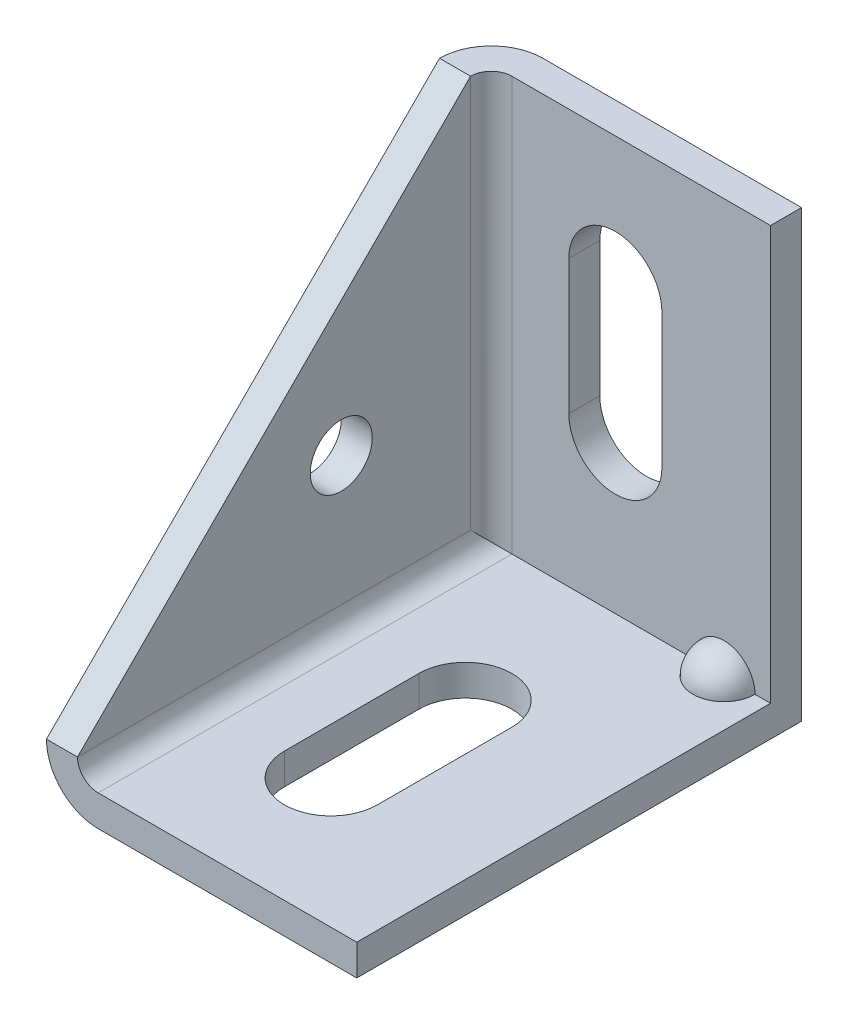
ISO-10303-21;
HEADER;
FILE_DESCRIPTION(('STEP AP214'),'2;1');
FILE_NAME('part.step','',(''),(''),'','','');
FILE_SCHEMA(('AUTOMOTIVE_DESIGN { 1 0 10303 214 1 1 1 1 }'));
ENDSEC;
DATA;
#1=APPLICATION_CONTEXT('core data for automotive mechanical design processes');
#2=APPLICATION_PROTOCOL_DEFINITION('international standard','automotive_design',2000,#1);
#3=PRODUCT_CONTEXT('',#1,'mechanical');
#4=PRODUCT('Part','Part','',(#3));
#5=PRODUCT_RELATED_PRODUCT_CATEGORY('part','',(#4));
#6=PRODUCT_DEFINITION_FORMATION('','',#4);
#7=PRODUCT_DEFINITION_CONTEXT('part definition',#1,'design');
#8=PRODUCT_DEFINITION('design','',#6,#7);
#9=PRODUCT_DEFINITION_SHAPE('','',#8);
#10=(LENGTH_UNIT() NAMED_UNIT(*) SI_UNIT(.MILLI.,.METRE.));
#11=(NAMED_UNIT(*) PLANE_ANGLE_UNIT() SI_UNIT($,.RADIAN.));
#12=(NAMED_UNIT(*) SI_UNIT($,.STERADIAN.) SOLID_ANGLE_UNIT());
#13=UNCERTAINTY_MEASURE_WITH_UNIT(LENGTH_MEASURE(1.E-05),#10,'distance_accuracy_value','');
#14=(GEOMETRIC_REPRESENTATION_CONTEXT(3) GLOBAL_UNCERTAINTY_ASSIGNED_CONTEXT((#13)) GLOBAL_UNIT_ASSIGNED_CONTEXT((#10,
#11,#12)) REPRESENTATION_CONTEXT('',''));
#15=CARTESIAN_POINT('',(0.,0.,0.));
#16=DIRECTION('',(0.,0.,1.));
#17=DIRECTION('',(1.,0.,0.));
#18=AXIS2_PLACEMENT_3D('',#15,#16,#17);
#19=CARTESIAN_POINT('',(10.5,3.,3.));
#20=DIRECTION('',(-1.,0.,0.));
#21=DIRECTION('',(0.,-0.707106781186547,-0.707106781186548));
#22=AXIS2_PLACEMENT_3D('',#19,#20,#21);
#23=SPHERICAL_SURFACE('',#22,3.);
#24=CARTESIAN_POINT('',(10.5,3.,3.));
#25=DIRECTION('',(0.,1.,0.));
#26=DIRECTION('',(1.,0.,0.));
#27=AXIS2_PLACEMENT_3D('',#24,#25,#26);
#28=CIRCLE('',#27,3.);
#29=CARTESIAN_POINT('',(7.5,3.,3.));
#30=VERTEX_POINT('',#29);
#31=CARTESIAN_POINT('',(13.5,3.,3.));
#32=VERTEX_POINT('',#31);
#33=EDGE_CURVE('E412',#30,#32,#28,.T.);
#34=ORIENTED_EDGE('',*,*,#33,.T.);
#35=CARTESIAN_POINT('',(10.5,3.,3.));
#36=DIRECTION('',(0.,0.,-1.));
#37=DIRECTION('',(1.,0.,0.));
#38=AXIS2_PLACEMENT_3D('',#35,#36,#37);
#39=CIRCLE('',#38,3.);
#40=EDGE_CURVE('E665',#30,#32,#39,.T.);
#41=ORIENTED_EDGE('',*,*,#40,.F.);
#42=EDGE_LOOP('',(#34,#41));
#43=FACE_BOUND('',#42,.T.);
#44=ADVANCED_FACE('F43',(#43),#23,.T.);
#45=CARTESIAN_POINT('',(15.,0.,43.));
#46=DIRECTION('',(1.,0.,0.));
#47=DIRECTION('',(0.,0.,-1.));
#48=AXIS2_PLACEMENT_3D('',#45,#46,#47);
#49=PLANE('',#48);
#50=DIRECTION('',(0.,0.,-1.));
#51=VECTOR('',#50,1.);
#52=CARTESIAN_POINT('',(15.,3.,43.));
#53=LINE('',#52,#51);
#54=CARTESIAN_POINT('',(15.,3.,43.));
#55=VERTEX_POINT('',#54);
#56=CARTESIAN_POINT('',(15.,3.,3.));
#57=VERTEX_POINT('',#56);
#58=EDGE_CURVE('E609',#55,#57,#53,.T.);
#59=ORIENTED_EDGE('',*,*,#58,.F.);
#60=DIRECTION('',(0.,1.,0.));
#61=VECTOR('',#60,1.);
#62=CARTESIAN_POINT('',(15.,0.,43.));
#63=LINE('',#62,#61);
#64=CARTESIAN_POINT('',(15.,0.,43.));
#65=VERTEX_POINT('',#64);
#66=EDGE_CURVE('E619',#65,#55,#63,.T.);
#67=ORIENTED_EDGE('',*,*,#66,.F.);
#68=DIRECTION('',(0.,0.,-1.));
#69=VECTOR('',#68,1.);
#70=CARTESIAN_POINT('',(15.,0.,43.));
#71=LINE('',#70,#69);
#72=CARTESIAN_POINT('',(15.,0.,0.));
#73=VERTEX_POINT('',#72);
#74=EDGE_CURVE('E633',#65,#73,#71,.T.);
#75=ORIENTED_EDGE('',*,*,#74,.T.);
#76=DIRECTION('',(0.,-1.,0.));
#77=VECTOR('',#76,1.);
#78=CARTESIAN_POINT('',(15.,0.,0.));
#79=LINE('',#78,#77);
#80=CARTESIAN_POINT('',(15.,43.,0.));
#81=VERTEX_POINT('',#80);
#82=EDGE_CURVE('E253',#81,#73,#79,.T.);
#83=ORIENTED_EDGE('',*,*,#82,.F.);
#84=DIRECTION('',(0.,0.,1.));
#85=VECTOR('',#84,1.);
#86=CARTESIAN_POINT('',(15.,43.,0.));
#87=LINE('',#86,#85);
#88=CARTESIAN_POINT('',(15.,43.,3.));
#89=VERTEX_POINT('',#88);
#90=EDGE_CURVE('E269',#81,#89,#87,.T.);
#91=ORIENTED_EDGE('',*,*,#90,.T.);
#92=DIRECTION('',(0.,-1.,0.));
#93=VECTOR('',#92,1.);
#94=CARTESIAN_POINT('',(15.,0.,3.));
#95=LINE('',#94,#93);
#96=EDGE_CURVE('E254',#89,#57,#95,.T.);
#97=ORIENTED_EDGE('',*,*,#96,.T.);
#98=EDGE_LOOP('',(#59,#67,#75,#83,#91,#97));
#99=FACE_BOUND('',#98,.T.);
#100=ADVANCED_FACE('F676',(#99),#49,.T.);
#101=CARTESIAN_POINT('',(-12.,0.,43.));
#102=DIRECTION('',(0.,0.,1.));
#103=DIRECTION('',(1.,0.,0.));
#104=AXIS2_PLACEMENT_3D('',#101,#102,#103);
#105=PLANE('',#104);
#106=DIRECTION('',(1.,0.,0.));
#107=VECTOR('',#106,1.);
#108=CARTESIAN_POINT('',(-15.,5.,43.));
#109=LINE('',#108,#107);
#110=CARTESIAN_POINT('',(-15.,5.,43.));
#111=VERTEX_POINT('',#110);
#112=CARTESIAN_POINT('',(-12.,5.,43.));
#113=VERTEX_POINT('',#112);
#114=EDGE_CURVE('E650',#111,#113,#109,.T.);
#115=ORIENTED_EDGE('',*,*,#114,.F.);
#116=CARTESIAN_POINT('',(-10.,5.,43.));
#117=DIRECTION('',(0.,0.,1.));
#118=DIRECTION('',(1.,0.,0.));
#119=AXIS2_PLACEMENT_3D('',#116,#117,#118);
#120=CIRCLE('',#119,5.);
#121=CARTESIAN_POINT('',(-10.,0.,43.));
#122=VERTEX_POINT('',#121);
#123=EDGE_CURVE('E53',#111,#122,#120,.T.);
#124=ORIENTED_EDGE('',*,*,#123,.T.);
#125=DIRECTION('',(1.,0.,0.));
#126=VECTOR('',#125,1.);
#127=CARTESIAN_POINT('',(-12.,0.,43.));
#128=LINE('',#127,#126);
#129=EDGE_CURVE('E628',#122,#65,#128,.T.);
#130=ORIENTED_EDGE('',*,*,#129,.T.);
#131=ORIENTED_EDGE('',*,*,#66,.T.);
#132=DIRECTION('',(1.,0.,0.));
#133=VECTOR('',#132,1.);
#134=CARTESIAN_POINT('',(-12.,3.,43.));
#135=LINE('',#134,#133);
#136=CARTESIAN_POINT('',(-10.,3.,43.));
#137=VERTEX_POINT('',#136);
#138=EDGE_CURVE('E615',#137,#55,#135,.T.);
#139=ORIENTED_EDGE('',*,*,#138,.F.);
#140=CARTESIAN_POINT('',(-10.,5.,43.));
#141=DIRECTION('',(0.,0.,1.));
#142=DIRECTION('',(1.,0.,0.));
#143=AXIS2_PLACEMENT_3D('',#140,#141,#142);
#144=CIRCLE('',#143,2.);
#145=EDGE_CURVE('E393',#137,#113,#144,.F.);
#146=ORIENTED_EDGE('',*,*,#145,.T.);
#147=EDGE_LOOP('',(#115,#124,#130,#131,#139,#146));
#148=FACE_BOUND('',#147,.T.);
#149=ADVANCED_FACE('F681',(#148),#105,.T.);
#150=CARTESIAN_POINT('',(0.,0.,0.));
#151=DIRECTION('',(0.,1.,0.));
#152=DIRECTION('',(0.,0.,1.));
#153=AXIS2_PLACEMENT_3D('',#150,#151,#152);
#154=PLANE('',#153);
#155=DIRECTION('',(0.,0.,1.));
#156=VECTOR('',#155,1.);
#157=CARTESIAN_POINT('',(-4.5,0.,17.5));
#158=LINE('',#157,#156);
#159=CARTESIAN_POINT('',(-4.5,0.,17.5));
#160=VERTEX_POINT('',#159);
#161=CARTESIAN_POINT('',(-4.5,0.,30.5));
#162=VERTEX_POINT('',#161);
#163=EDGE_CURVE('E248',#160,#162,#158,.T.);
#164=ORIENTED_EDGE('',*,*,#163,.T.);
#165=CARTESIAN_POINT('',(0.,0.,30.5));
#166=DIRECTION('',(0.,1.,0.));
#167=DIRECTION('',(0.,0.,1.));
#168=AXIS2_PLACEMENT_3D('',#165,#166,#167);
#169=CIRCLE('',#168,4.5);
#170=CARTESIAN_POINT('',(4.5,0.,30.5));
#171=VERTEX_POINT('',#170);
#172=EDGE_CURVE('E231',#162,#171,#169,.T.);
#173=ORIENTED_EDGE('',*,*,#172,.T.);
#174=DIRECTION('',(0.,0.,-1.));
#175=VECTOR('',#174,1.);
#176=CARTESIAN_POINT('',(4.5,0.,30.5));
#177=LINE('',#176,#175);
#178=CARTESIAN_POINT('',(4.5,0.,17.5));
#179=VERTEX_POINT('',#178);
#180=EDGE_CURVE('E319',#171,#179,#177,.T.);
#181=ORIENTED_EDGE('',*,*,#180,.T.);
#182=CARTESIAN_POINT('',(0.,0.,17.5));
#183=DIRECTION('',(0.,1.,0.));
#184=DIRECTION('',(0.,0.,1.));
#185=AXIS2_PLACEMENT_3D('',#182,#183,#184);
#186=CIRCLE('',#185,4.5);
#187=EDGE_CURVE('E314',#179,#160,#186,.T.);
#188=ORIENTED_EDGE('',*,*,#187,.T.);
#189=EDGE_LOOP('',(#164,#173,#181,#188));
#190=FACE_BOUND('',#189,.T.);
#191=ORIENTED_EDGE('',*,*,#129,.F.);
#192=DIRECTION('',(0.,0.,1.));
#193=VECTOR('',#192,1.);
#194=CARTESIAN_POINT('',(-10.,0.,0.));
#195=LINE('',#194,#193);
#196=CARTESIAN_POINT('',(-10.,0.,0.));
#197=VERTEX_POINT('',#196);
#198=EDGE_CURVE('E12',#122,#197,#195,.F.);
#199=ORIENTED_EDGE('',*,*,#198,.T.);
#200=DIRECTION('',(-1.,0.,0.));
#201=VECTOR('',#200,1.);
#202=CARTESIAN_POINT('',(-15.,0.,0.));
#203=LINE('',#202,#201);
#204=EDGE_CURVE('E940',#73,#197,#203,.T.);
#205=ORIENTED_EDGE('',*,*,#204,.F.);
#206=ORIENTED_EDGE('',*,*,#74,.F.);
#207=EDGE_LOOP('',(#191,#199,#205,#206));
#208=FACE_BOUND('',#207,.T.);
#209=ADVANCED_FACE('F316',(#190,#208),#154,.F.);
#210=CARTESIAN_POINT('',(0.,3.,0.));
#211=DIRECTION('',(0.,1.,0.));
#212=DIRECTION('',(0.,0.,1.));
#213=AXIS2_PLACEMENT_3D('',#210,#211,#212);
#214=PLANE('',#213);
#215=CARTESIAN_POINT('',(0.,3.,30.5));
#216=DIRECTION('',(0.,1.,0.));
#217=DIRECTION('',(0.,0.,1.));
#218=AXIS2_PLACEMENT_3D('',#215,#216,#217);
#219=CIRCLE('',#218,4.5);
#220=CARTESIAN_POINT('',(-4.5,3.,30.5));
#221=VERTEX_POINT('',#220);
#222=CARTESIAN_POINT('',(4.5,3.,30.5));
#223=VERTEX_POINT('',#222);
#224=EDGE_CURVE('E281',#221,#223,#219,.T.);
#225=ORIENTED_EDGE('',*,*,#224,.F.);
#226=DIRECTION('',(0.,0.,1.));
#227=VECTOR('',#226,1.);
#228=CARTESIAN_POINT('',(-4.5,3.,17.5));
#229=LINE('',#228,#227);
#230=CARTESIAN_POINT('',(-4.5,3.,17.5));
#231=VERTEX_POINT('',#230);
#232=EDGE_CURVE('E225',#231,#221,#229,.T.);
#233=ORIENTED_EDGE('',*,*,#232,.F.);
#234=CARTESIAN_POINT('',(0.,3.,17.5));
#235=DIRECTION('',(0.,1.,0.));
#236=DIRECTION('',(0.,0.,1.));
#237=AXIS2_PLACEMENT_3D('',#234,#235,#236);
#238=CIRCLE('',#237,4.5);
#239=CARTESIAN_POINT('',(4.5,3.,17.5));
#240=VERTEX_POINT('',#239);
#241=EDGE_CURVE('E232',#240,#231,#238,.T.);
#242=ORIENTED_EDGE('',*,*,#241,.F.);
#243=DIRECTION('',(0.,0.,-1.));
#244=VECTOR('',#243,1.);
#245=CARTESIAN_POINT('',(4.5,3.,30.5));
#246=LINE('',#245,#244);
#247=EDGE_CURVE('E285',#223,#240,#246,.T.);
#248=ORIENTED_EDGE('',*,*,#247,.F.);
#249=EDGE_LOOP('',(#225,#233,#242,#248));
#250=FACE_BOUND('',#249,.T.);
#251=DIRECTION('',(-1.,0.,0.));
#252=VECTOR('',#251,1.);
#253=CARTESIAN_POINT('',(15.,3.,3.));
#254=LINE('',#253,#252);
#255=CARTESIAN_POINT('',(-10.,3.,3.));
#256=VERTEX_POINT('',#255);
#257=EDGE_CURVE('E614',#30,#256,#254,.T.);
#258=ORIENTED_EDGE('',*,*,#257,.T.);
#259=DIRECTION('',(0.,0.,1.));
#260=VECTOR('',#259,1.);
#261=CARTESIAN_POINT('',(-10.,3.,43.));
#262=LINE('',#261,#260);
#263=EDGE_CURVE('E409',#256,#137,#262,.T.);
#264=ORIENTED_EDGE('',*,*,#263,.T.);
#265=ORIENTED_EDGE('',*,*,#138,.T.);
#266=ORIENTED_EDGE('',*,*,#58,.T.);
#267=EDGE_CURVE('E625',#57,#32,#254,.T.);
#268=ORIENTED_EDGE('',*,*,#267,.T.);
#269=ORIENTED_EDGE('',*,*,#33,.F.);
#270=EDGE_LOOP('',(#258,#264,#265,#266,#268,#269));
#271=FACE_BOUND('',#270,.T.);
#272=ADVANCED_FACE('F304',(#250,#271),#214,.T.);
#273=CARTESIAN_POINT('',(-12.,0.,0.));
#274=DIRECTION('',(1.,0.,0.));
#275=DIRECTION('',(0.,0.,-1.));
#276=AXIS2_PLACEMENT_3D('',#273,#274,#275);
#277=PLANE('',#276);
#278=CARTESIAN_POINT('',(-12.,17.5,17.5));
#279=DIRECTION('',(1.,0.,0.));
#280=DIRECTION('',(0.,0.,-1.));
#281=AXIS2_PLACEMENT_3D('',#278,#279,#280);
#282=CIRCLE('',#281,2.99999999999999);
#283=CARTESIAN_POINT('',(-12.,17.5,14.5));
#284=VERTEX_POINT('',#283);
#285=EDGE_CURVE('E347',#284,#284,#282,.T.);
#286=ORIENTED_EDGE('',*,*,#285,.F.);
#287=EDGE_LOOP('',(#286));
#288=FACE_BOUND('',#287,.T.);
#289=DIRECTION('',(0.,0.707106781186548,-0.707106781186548));
#290=VECTOR('',#289,1.);
#291=CARTESIAN_POINT('',(-12.,43.,5.));
#292=LINE('',#291,#290);
#293=CARTESIAN_POINT('',(-12.,43.,5.));
#294=VERTEX_POINT('',#293);
#295=EDGE_CURVE('E268',#113,#294,#292,.T.);
#296=ORIENTED_EDGE('',*,*,#295,.F.);
#297=DIRECTION('',(0.,0.,1.));
#298=VECTOR('',#297,1.);
#299=CARTESIAN_POINT('',(-12.,5.,3.));
#300=LINE('',#299,#298);
#301=CARTESIAN_POINT('',(-12.,5.,5.));
#302=VERTEX_POINT('',#301);
#303=EDGE_CURVE('E401',#113,#302,#300,.F.);
#304=ORIENTED_EDGE('',*,*,#303,.T.);
#305=DIRECTION('',(0.,-1.,0.));
#306=VECTOR('',#305,1.);
#307=CARTESIAN_POINT('',(-12.,43.,5.));
#308=LINE('',#307,#306);
#309=EDGE_CURVE('E406',#302,#294,#308,.F.);
#310=ORIENTED_EDGE('',*,*,#309,.T.);
#311=EDGE_LOOP('',(#296,#304,#310));
#312=FACE_BOUND('',#311,.T.);
#313=ADVANCED_FACE('F645',(#288,#312),#277,.T.);
#314=CARTESIAN_POINT('',(-15.,43.,5.));
#315=DIRECTION('',(0.,-0.707106781186548,-0.707106781186547));
#316=DIRECTION('',(0.,0.707106781186547,-0.707106781186548));
#317=AXIS2_PLACEMENT_3D('',#314,#315,#316);
#318=PLANE('',#317);
#319=ORIENTED_EDGE('',*,*,#295,.T.);
#320=DIRECTION('',(1.,0.,0.));
#321=VECTOR('',#320,1.);
#322=CARTESIAN_POINT('',(-15.,43.,5.));
#323=LINE('',#322,#321);
#324=CARTESIAN_POINT('',(-15.,43.,5.));
#325=VERTEX_POINT('',#324);
#326=EDGE_CURVE('E267',#325,#294,#323,.T.);
#327=ORIENTED_EDGE('',*,*,#326,.F.);
#328=DIRECTION('',(0.,0.707106781186548,-0.707106781186548));
#329=VECTOR('',#328,1.);
#330=CARTESIAN_POINT('',(-15.,43.,5.));
#331=LINE('',#330,#329);
#332=EDGE_CURVE('E262',#111,#325,#331,.T.);
#333=ORIENTED_EDGE('',*,*,#332,.F.);
#334=ORIENTED_EDGE('',*,*,#114,.T.);
#335=EDGE_LOOP('',(#319,#327,#333,#334));
#336=FACE_BOUND('',#335,.T.);
#337=ADVANCED_FACE('F648',(#336),#318,.F.);
#338=CARTESIAN_POINT('',(-15.,43.,3.));
#339=DIRECTION('',(0.,-1.,0.));
#340=DIRECTION('',(0.,0.,-1.));
#341=AXIS2_PLACEMENT_3D('',#338,#339,#340);
#342=PLANE('',#341);
#343=DIRECTION('',(1.,0.,0.));
#344=VECTOR('',#343,1.);
#345=CARTESIAN_POINT('',(15.,43.,0.));
#346=LINE('',#345,#344);
#347=CARTESIAN_POINT('',(-10.,43.,0.));
#348=VERTEX_POINT('',#347);
#349=EDGE_CURVE('E249',#348,#81,#346,.T.);
#350=ORIENTED_EDGE('',*,*,#349,.F.);
#351=CARTESIAN_POINT('',(-10.,43.,5.));
#352=DIRECTION('',(0.,-1.,0.));
#353=DIRECTION('',(0.,0.,-1.));
#354=AXIS2_PLACEMENT_3D('',#351,#352,#353);
#355=CIRCLE('',#354,5.);
#356=EDGE_CURVE('E383',#348,#325,#355,.F.);
#357=ORIENTED_EDGE('',*,*,#356,.T.);
#358=ORIENTED_EDGE('',*,*,#326,.T.);
#359=CARTESIAN_POINT('',(-10.,43.,5.));
#360=DIRECTION('',(0.,-1.,0.));
#361=DIRECTION('',(0.,0.,-1.));
#362=AXIS2_PLACEMENT_3D('',#359,#360,#361);
#363=CIRCLE('',#362,2.);
#364=CARTESIAN_POINT('',(-10.,43.,3.));
#365=VERTEX_POINT('',#364);
#366=EDGE_CURVE('E368',#294,#365,#363,.T.);
#367=ORIENTED_EDGE('',*,*,#366,.T.);
#368=DIRECTION('',(1.,0.,0.));
#369=VECTOR('',#368,1.);
#370=CARTESIAN_POINT('',(15.,43.,3.));
#371=LINE('',#370,#369);
#372=EDGE_CURVE('E237',#365,#89,#371,.T.);
#373=ORIENTED_EDGE('',*,*,#372,.T.);
#374=ORIENTED_EDGE('',*,*,#90,.F.);
#375=EDGE_LOOP('',(#350,#357,#358,#367,#373,#374));
#376=FACE_BOUND('',#375,.T.);
#377=ADVANCED_FACE('F651',(#376),#342,.F.);
#378=CARTESIAN_POINT('',(-15.,0.,0.));
#379=DIRECTION('',(1.,0.,0.));
#380=DIRECTION('',(0.,0.,-1.));
#381=AXIS2_PLACEMENT_3D('',#378,#379,#380);
#382=PLANE('',#381);
#383=CARTESIAN_POINT('',(-15.,17.5,17.5));
#384=DIRECTION('',(1.,0.,0.));
#385=DIRECTION('',(0.,0.,-1.));
#386=AXIS2_PLACEMENT_3D('',#383,#384,#385);
#387=CIRCLE('',#386,2.99999999999999);
#388=CARTESIAN_POINT('',(-15.,17.5,14.5));
#389=VERTEX_POINT('',#388);
#390=EDGE_CURVE('E205',#389,#389,#387,.T.);
#391=ORIENTED_EDGE('',*,*,#390,.T.);
#392=EDGE_LOOP('',(#391));
#393=FACE_BOUND('',#392,.T.);
#394=ORIENTED_EDGE('',*,*,#332,.T.);
#395=DIRECTION('',(0.,1.,0.));
#396=VECTOR('',#395,1.);
#397=CARTESIAN_POINT('',(-15.,0.,5.));
#398=LINE('',#397,#396);
#399=CARTESIAN_POINT('',(-15.,5.,5.));
#400=VERTEX_POINT('',#399);
#401=EDGE_CURVE('E67',#325,#400,#398,.F.);
#402=ORIENTED_EDGE('',*,*,#401,.T.);
#403=DIRECTION('',(0.,0.,1.));
#404=VECTOR('',#403,1.);
#405=CARTESIAN_POINT('',(-15.,5.,0.));
#406=LINE('',#405,#404);
#407=EDGE_CURVE('E381',#400,#111,#406,.T.);
#408=ORIENTED_EDGE('',*,*,#407,.T.);
#409=EDGE_LOOP('',(#394,#402,#408));
#410=FACE_BOUND('',#409,.T.);
#411=ADVANCED_FACE('F698',(#393,#410),#382,.F.);
#412=CARTESIAN_POINT('',(0.,0.,3.));
#413=DIRECTION('',(0.,0.,1.));
#414=DIRECTION('',(1.,0.,0.));
#415=AXIS2_PLACEMENT_3D('',#412,#413,#414);
#416=PLANE('',#415);
#417=CARTESIAN_POINT('',(0.,17.5,3.));
#418=DIRECTION('',(0.,0.,1.));
#419=DIRECTION('',(1.,0.,0.));
#420=AXIS2_PLACEMENT_3D('',#417,#418,#419);
#421=CIRCLE('',#420,4.5);
#422=CARTESIAN_POINT('',(-4.5,17.5,3.));
#423=VERTEX_POINT('',#422);
#424=CARTESIAN_POINT('',(4.5,17.5,3.));
#425=VERTEX_POINT('',#424);
#426=EDGE_CURVE('E177',#423,#425,#421,.T.);
#427=ORIENTED_EDGE('',*,*,#426,.F.);
#428=DIRECTION('',(0.,-1.,0.));
#429=VECTOR('',#428,1.);
#430=CARTESIAN_POINT('',(-4.5,30.5,3.));
#431=LINE('',#430,#429);
#432=CARTESIAN_POINT('',(-4.5,30.5,3.));
#433=VERTEX_POINT('',#432);
#434=EDGE_CURVE('E198',#433,#423,#431,.T.);
#435=ORIENTED_EDGE('',*,*,#434,.F.);
#436=CARTESIAN_POINT('',(0.,30.5,3.));
#437=DIRECTION('',(0.,0.,1.));
#438=DIRECTION('',(1.,0.,0.));
#439=AXIS2_PLACEMENT_3D('',#436,#437,#438);
#440=CIRCLE('',#439,4.5);
#441=CARTESIAN_POINT('',(4.5,30.5,3.));
#442=VERTEX_POINT('',#441);
#443=EDGE_CURVE('E202',#442,#433,#440,.T.);
#444=ORIENTED_EDGE('',*,*,#443,.F.);
#445=DIRECTION('',(0.,1.,0.));
#446=VECTOR('',#445,1.);
#447=CARTESIAN_POINT('',(4.5,17.5,3.));
#448=LINE('',#447,#446);
#449=EDGE_CURVE('E338',#425,#442,#448,.T.);
#450=ORIENTED_EDGE('',*,*,#449,.F.);
#451=EDGE_LOOP('',(#427,#435,#444,#450));
#452=FACE_BOUND('',#451,.T.);
#453=ORIENTED_EDGE('',*,*,#372,.F.);
#454=DIRECTION('',(0.,-1.,0.));
#455=VECTOR('',#454,1.);
#456=CARTESIAN_POINT('',(-10.,3.,3.));
#457=LINE('',#456,#455);
#458=EDGE_CURVE('E397',#365,#256,#457,.T.);
#459=ORIENTED_EDGE('',*,*,#458,.T.);
#460=ORIENTED_EDGE('',*,*,#257,.F.);
#461=ORIENTED_EDGE('',*,*,#40,.T.);
#462=ORIENTED_EDGE('',*,*,#267,.F.);
#463=ORIENTED_EDGE('',*,*,#96,.F.);
#464=EDGE_LOOP('',(#453,#459,#460,#461,#462,#463));
#465=FACE_BOUND('',#464,.T.);
#466=ADVANCED_FACE('F718',(#452,#465),#416,.T.);
#467=CARTESIAN_POINT('',(0.,0.,0.));
#468=DIRECTION('',(0.,0.,1.));
#469=DIRECTION('',(1.,0.,0.));
#470=AXIS2_PLACEMENT_3D('',#467,#468,#469);
#471=PLANE('',#470);
#472=DIRECTION('',(0.,-1.,0.));
#473=VECTOR('',#472,1.);
#474=CARTESIAN_POINT('',(-4.5,30.5,0.));
#475=LINE('',#474,#473);
#476=CARTESIAN_POINT('',(-4.5,30.5,0.));
#477=VERTEX_POINT('',#476);
#478=CARTESIAN_POINT('',(-4.5,17.5,0.));
#479=VERTEX_POINT('',#478);
#480=EDGE_CURVE('E183',#477,#479,#475,.T.);
#481=ORIENTED_EDGE('',*,*,#480,.T.);
#482=CARTESIAN_POINT('',(0.,17.5,0.));
#483=DIRECTION('',(0.,0.,1.));
#484=DIRECTION('',(1.,0.,0.));
#485=AXIS2_PLACEMENT_3D('',#482,#483,#484);
#486=CIRCLE('',#485,4.5);
#487=CARTESIAN_POINT('',(4.5,17.5,0.));
#488=VERTEX_POINT('',#487);
#489=EDGE_CURVE('E174',#479,#488,#486,.T.);
#490=ORIENTED_EDGE('',*,*,#489,.T.);
#491=DIRECTION('',(0.,1.,0.));
#492=VECTOR('',#491,1.);
#493=CARTESIAN_POINT('',(4.5,17.5,0.));
#494=LINE('',#493,#492);
#495=CARTESIAN_POINT('',(4.5,30.5,0.));
#496=VERTEX_POINT('',#495);
#497=EDGE_CURVE('E187',#488,#496,#494,.T.);
#498=ORIENTED_EDGE('',*,*,#497,.T.);
#499=CARTESIAN_POINT('',(0.,30.5,0.));
#500=DIRECTION('',(0.,0.,1.));
#501=DIRECTION('',(1.,0.,0.));
#502=AXIS2_PLACEMENT_3D('',#499,#500,#501);
#503=CIRCLE('',#502,4.5);
#504=EDGE_CURVE('E192',#496,#477,#503,.T.);
#505=ORIENTED_EDGE('',*,*,#504,.T.);
#506=EDGE_LOOP('',(#481,#490,#498,#505));
#507=FACE_BOUND('',#506,.T.);
#508=ORIENTED_EDGE('',*,*,#204,.T.);
#509=DIRECTION('',(0.,1.,0.));
#510=VECTOR('',#509,1.);
#511=CARTESIAN_POINT('',(-10.,0.,0.));
#512=LINE('',#511,#510);
#513=EDGE_CURVE('E371',#197,#348,#512,.T.);
#514=ORIENTED_EDGE('',*,*,#513,.T.);
#515=ORIENTED_EDGE('',*,*,#349,.T.);
#516=ORIENTED_EDGE('',*,*,#82,.T.);
#517=EDGE_LOOP('',(#508,#514,#515,#516));
#518=FACE_BOUND('',#517,.T.);
#519=ADVANCED_FACE('F194',(#507,#518),#471,.F.);
#520=CARTESIAN_POINT('',(0.,0.,30.5));
#521=DIRECTION('',(0.,1.,0.));
#522=DIRECTION('',(0.,0.,1.));
#523=AXIS2_PLACEMENT_3D('',#520,#521,#522);
#524=CYLINDRICAL_SURFACE('',#523,4.5);
#525=ORIENTED_EDGE('',*,*,#224,.T.);
#526=DIRECTION('',(0.,1.,0.));
#527=VECTOR('',#526,1.);
#528=CARTESIAN_POINT('',(4.5,0.,30.5));
#529=LINE('',#528,#527);
#530=EDGE_CURVE('E244',#171,#223,#529,.T.);
#531=ORIENTED_EDGE('',*,*,#530,.F.);
#532=ORIENTED_EDGE('',*,*,#172,.F.);
#533=DIRECTION('',(0.,1.,0.));
#534=VECTOR('',#533,1.);
#535=CARTESIAN_POINT('',(-4.5,0.,30.5));
#536=LINE('',#535,#534);
#537=EDGE_CURVE('E234',#162,#221,#536,.T.);
#538=ORIENTED_EDGE('',*,*,#537,.T.);
#539=EDGE_LOOP('',(#525,#531,#532,#538));
#540=FACE_BOUND('',#539,.T.);
#541=ADVANCED_FACE('F724',(#540),#524,.F.);
#542=CARTESIAN_POINT('',(-4.5,0.,17.5));
#543=DIRECTION('',(-1.,0.,0.));
#544=DIRECTION('',(0.,0.,1.));
#545=AXIS2_PLACEMENT_3D('',#542,#543,#544);
#546=PLANE('',#545);
#547=ORIENTED_EDGE('',*,*,#232,.T.);
#548=ORIENTED_EDGE('',*,*,#537,.F.);
#549=ORIENTED_EDGE('',*,*,#163,.F.);
#550=DIRECTION('',(0.,1.,0.));
#551=VECTOR('',#550,1.);
#552=CARTESIAN_POINT('',(-4.5,0.,17.5));
#553=LINE('',#552,#551);
#554=EDGE_CURVE('E238',#160,#231,#553,.T.);
#555=ORIENTED_EDGE('',*,*,#554,.T.);
#556=EDGE_LOOP('',(#547,#548,#549,#555));
#557=FACE_BOUND('',#556,.T.);
#558=ADVANCED_FACE('F307',(#557),#546,.F.);
#559=CARTESIAN_POINT('',(0.,0.,17.5));
#560=DIRECTION('',(0.,1.,0.));
#561=DIRECTION('',(0.,0.,1.));
#562=AXIS2_PLACEMENT_3D('',#559,#560,#561);
#563=CYLINDRICAL_SURFACE('',#562,4.5);
#564=ORIENTED_EDGE('',*,*,#241,.T.);
#565=ORIENTED_EDGE('',*,*,#554,.F.);
#566=ORIENTED_EDGE('',*,*,#187,.F.);
#567=DIRECTION('',(0.,1.,0.));
#568=VECTOR('',#567,1.);
#569=CARTESIAN_POINT('',(4.5,0.,17.5));
#570=LINE('',#569,#568);
#571=EDGE_CURVE('E241',#179,#240,#570,.T.);
#572=ORIENTED_EDGE('',*,*,#571,.T.);
#573=EDGE_LOOP('',(#564,#565,#566,#572));
#574=FACE_BOUND('',#573,.T.);
#575=ADVANCED_FACE('F300',(#574),#563,.F.);
#576=CARTESIAN_POINT('',(4.5,0.,30.5));
#577=DIRECTION('',(1.,0.,0.));
#578=DIRECTION('',(0.,0.,-1.));
#579=AXIS2_PLACEMENT_3D('',#576,#577,#578);
#580=PLANE('',#579);
#581=ORIENTED_EDGE('',*,*,#247,.T.);
#582=ORIENTED_EDGE('',*,*,#571,.F.);
#583=ORIENTED_EDGE('',*,*,#180,.F.);
#584=ORIENTED_EDGE('',*,*,#530,.T.);
#585=EDGE_LOOP('',(#581,#582,#583,#584));
#586=FACE_BOUND('',#585,.T.);
#587=ADVANCED_FACE('F728',(#586),#580,.F.);
#588=CARTESIAN_POINT('',(0.,17.5,0.));
#589=DIRECTION('',(0.,0.,1.));
#590=DIRECTION('',(1.,0.,0.));
#591=AXIS2_PLACEMENT_3D('',#588,#589,#590);
#592=CYLINDRICAL_SURFACE('',#591,4.5);
#593=ORIENTED_EDGE('',*,*,#426,.T.);
#594=DIRECTION('',(0.,0.,1.));
#595=VECTOR('',#594,1.);
#596=CARTESIAN_POINT('',(4.5,17.5,0.));
#597=LINE('',#596,#595);
#598=EDGE_CURVE('E170',#488,#425,#597,.T.);
#599=ORIENTED_EDGE('',*,*,#598,.F.);
#600=ORIENTED_EDGE('',*,*,#489,.F.);
#601=DIRECTION('',(0.,0.,1.));
#602=VECTOR('',#601,1.);
#603=CARTESIAN_POINT('',(-4.5,17.5,0.));
#604=LINE('',#603,#602);
#605=EDGE_CURVE('E286',#479,#423,#604,.T.);
#606=ORIENTED_EDGE('',*,*,#605,.T.);
#607=EDGE_LOOP('',(#593,#599,#600,#606));
#608=FACE_BOUND('',#607,.T.);
#609=ADVANCED_FACE('F172',(#608),#592,.F.);
#610=CARTESIAN_POINT('',(-4.5,30.5,0.));
#611=DIRECTION('',(-1.,0.,0.));
#612=DIRECTION('',(0.,-1.,0.));
#613=AXIS2_PLACEMENT_3D('',#610,#611,#612);
#614=PLANE('',#613);
#615=ORIENTED_EDGE('',*,*,#434,.T.);
#616=ORIENTED_EDGE('',*,*,#605,.F.);
#617=ORIENTED_EDGE('',*,*,#480,.F.);
#618=DIRECTION('',(0.,0.,1.));
#619=VECTOR('',#618,1.);
#620=CARTESIAN_POINT('',(-4.5,30.5,0.));
#621=LINE('',#620,#619);
#622=EDGE_CURVE('E328',#477,#433,#621,.T.);
#623=ORIENTED_EDGE('',*,*,#622,.T.);
#624=EDGE_LOOP('',(#615,#616,#617,#623));
#625=FACE_BOUND('',#624,.T.);
#626=ADVANCED_FACE('F737',(#625),#614,.F.);
#627=CARTESIAN_POINT('',(0.,30.5,0.));
#628=DIRECTION('',(0.,0.,1.));
#629=DIRECTION('',(1.,0.,0.));
#630=AXIS2_PLACEMENT_3D('',#627,#628,#629);
#631=CYLINDRICAL_SURFACE('',#630,4.5);
#632=ORIENTED_EDGE('',*,*,#443,.T.);
#633=ORIENTED_EDGE('',*,*,#622,.F.);
#634=ORIENTED_EDGE('',*,*,#504,.F.);
#635=DIRECTION('',(0.,0.,1.));
#636=VECTOR('',#635,1.);
#637=CARTESIAN_POINT('',(4.5,30.5,0.));
#638=LINE('',#637,#636);
#639=EDGE_CURVE('E182',#496,#442,#638,.T.);
#640=ORIENTED_EDGE('',*,*,#639,.T.);
#641=EDGE_LOOP('',(#632,#633,#634,#640));
#642=FACE_BOUND('',#641,.T.);
#643=ADVANCED_FACE('F740',(#642),#631,.F.);
#644=CARTESIAN_POINT('',(4.5,17.5,0.));
#645=DIRECTION('',(1.,0.,0.));
#646=DIRECTION('',(0.,0.,-1.));
#647=AXIS2_PLACEMENT_3D('',#644,#645,#646);
#648=PLANE('',#647);
#649=ORIENTED_EDGE('',*,*,#449,.T.);
#650=ORIENTED_EDGE('',*,*,#639,.F.);
#651=ORIENTED_EDGE('',*,*,#497,.F.);
#652=ORIENTED_EDGE('',*,*,#598,.T.);
#653=EDGE_LOOP('',(#649,#650,#651,#652));
#654=FACE_BOUND('',#653,.T.);
#655=ADVANCED_FACE('F188',(#654),#648,.F.);
#656=CARTESIAN_POINT('',(-12.,17.5,17.5));
#657=DIRECTION('',(1.,0.,0.));
#658=DIRECTION('',(0.,0.,-1.));
#659=AXIS2_PLACEMENT_3D('',#656,#657,#658);
#660=CYLINDRICAL_SURFACE('',#659,2.99999999999999);
#661=ORIENTED_EDGE('',*,*,#390,.F.);
#662=EDGE_LOOP('',(#661));
#663=FACE_BOUND('',#662,.T.);
#664=ORIENTED_EDGE('',*,*,#285,.T.);
#665=EDGE_LOOP('',(#664));
#666=FACE_BOUND('',#665,.T.);
#667=ADVANCED_FACE('F688',(#663,#666),#660,.F.);
#668=CARTESIAN_POINT('',(-10.,0.,5.));
#669=DIRECTION('',(0.,1.,0.));
#670=DIRECTION('',(0.,0.,1.));
#671=AXIS2_PLACEMENT_3D('',#668,#669,#670);
#672=CYLINDRICAL_SURFACE('',#671,2.);
#673=ORIENTED_EDGE('',*,*,#366,.F.);
#674=ORIENTED_EDGE('',*,*,#309,.F.);
#675=CARTESIAN_POINT('',(-10.,5.,5.));
#676=DIRECTION('',(0.,0.707106781186547,-0.707106781186547));
#677=DIRECTION('',(0.,-0.707106781186547,-0.707106781186547));
#678=AXIS2_PLACEMENT_3D('',#675,#676,#677);
#679=ELLIPSE('',#678,2.82842712474619,2.);
#680=EDGE_CURVE('E352',#256,#302,#679,.T.);
#681=ORIENTED_EDGE('',*,*,#680,.F.);
#682=ORIENTED_EDGE('',*,*,#458,.F.);
#683=EDGE_LOOP('',(#673,#674,#681,#682));
#684=FACE_BOUND('',#683,.T.);
#685=ADVANCED_FACE('F641',(#684),#672,.F.);
#686=CARTESIAN_POINT('',(-10.,5.,0.));
#687=DIRECTION('',(0.,0.,-1.));
#688=DIRECTION('',(-1.,0.,0.));
#689=AXIS2_PLACEMENT_3D('',#686,#687,#688);
#690=CYLINDRICAL_SURFACE('',#689,2.);
#691=ORIENTED_EDGE('',*,*,#680,.T.);
#692=ORIENTED_EDGE('',*,*,#303,.F.);
#693=ORIENTED_EDGE('',*,*,#145,.F.);
#694=ORIENTED_EDGE('',*,*,#263,.F.);
#695=EDGE_LOOP('',(#691,#692,#693,#694));
#696=FACE_BOUND('',#695,.T.);
#697=ADVANCED_FACE('F642',(#696),#690,.F.);
#698=CARTESIAN_POINT('',(-10.,5.,0.));
#699=DIRECTION('',(0.,0.,1.));
#700=DIRECTION('',(1.,0.,0.));
#701=AXIS2_PLACEMENT_3D('',#698,#699,#700);
#702=CYLINDRICAL_SURFACE('',#701,5.);
#703=ORIENTED_EDGE('',*,*,#123,.F.);
#704=ORIENTED_EDGE('',*,*,#407,.F.);
#705=CARTESIAN_POINT('',(-10.,5.,5.));
#706=DIRECTION('',(0.,-0.707106781186547,0.707106781186547));
#707=DIRECTION('',(0.,0.707106781186547,0.707106781186547));
#708=AXIS2_PLACEMENT_3D('',#705,#706,#707);
#709=ELLIPSE('',#708,7.07106781186547,5.);
#710=EDGE_CURVE('E47',#197,#400,#709,.F.);
#711=ORIENTED_EDGE('',*,*,#710,.F.);
#712=ORIENTED_EDGE('',*,*,#198,.F.);
#713=EDGE_LOOP('',(#703,#704,#711,#712));
#714=FACE_BOUND('',#713,.T.);
#715=ADVANCED_FACE('F45',(#714),#702,.T.);
#716=CARTESIAN_POINT('',(-10.,0.,5.));
#717=DIRECTION('',(0.,1.,0.));
#718=DIRECTION('',(0.,0.,1.));
#719=AXIS2_PLACEMENT_3D('',#716,#717,#718);
#720=CYLINDRICAL_SURFACE('',#719,5.);
#721=ORIENTED_EDGE('',*,*,#710,.T.);
#722=ORIENTED_EDGE('',*,*,#401,.F.);
#723=ORIENTED_EDGE('',*,*,#356,.F.);
#724=ORIENTED_EDGE('',*,*,#513,.F.);
#725=EDGE_LOOP('',(#721,#722,#723,#724));
#726=FACE_BOUND('',#725,.T.);
#727=ADVANCED_FACE('F689',(#726),#720,.T.);
#728=CLOSED_SHELL('',(#44,#100,#149,#209,#272,#313,#337,#377,#411,#466,#519,#541,#558,#575,#587,
#609,#626,#643,#655,#667,#685,#697,#715,#727));
#729=MANIFOLD_SOLID_BREP('B2',#728);
#730=ADVANCED_BREP_SHAPE_REPRESENTATION('',(#18,#729),#14);
#731=SHAPE_DEFINITION_REPRESENTATION(#9,#730);
ENDSEC;
END-ISO-10303-21;
